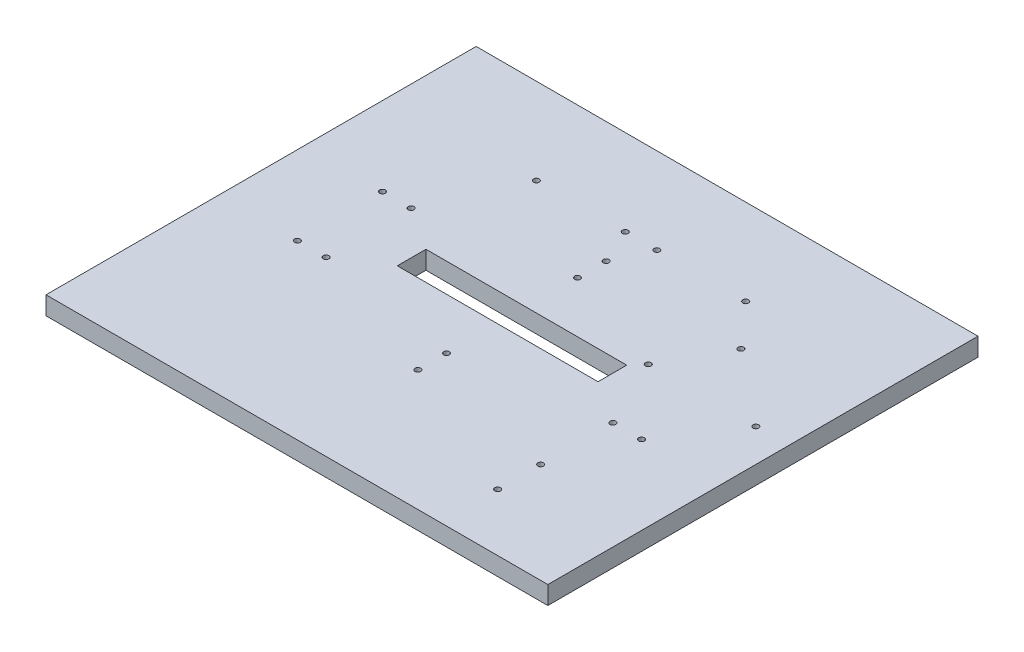
ISO-10303-21;
HEADER;
FILE_DESCRIPTION(('STEP AP214'),'2;1');
FILE_NAME('part.step','',(''),(''),'','','');
FILE_SCHEMA(('AUTOMOTIVE_DESIGN { 1 0 10303 214 1 1 1 1 }'));
ENDSEC;
DATA;
#1=APPLICATION_CONTEXT('core data for automotive mechanical design processes');
#2=APPLICATION_PROTOCOL_DEFINITION('international standard','automotive_design',2000,#1);
#3=PRODUCT_CONTEXT('',#1,'mechanical');
#4=PRODUCT('Part','Part','',(#3));
#5=PRODUCT_RELATED_PRODUCT_CATEGORY('part','',(#4));
#6=PRODUCT_DEFINITION_FORMATION('','',#4);
#7=PRODUCT_DEFINITION_CONTEXT('part definition',#1,'design');
#8=PRODUCT_DEFINITION('design','',#6,#7);
#9=PRODUCT_DEFINITION_SHAPE('','',#8);
#10=(LENGTH_UNIT() NAMED_UNIT(*) SI_UNIT(.MILLI.,.METRE.));
#11=(NAMED_UNIT(*) PLANE_ANGLE_UNIT() SI_UNIT($,.RADIAN.));
#12=(NAMED_UNIT(*) SI_UNIT($,.STERADIAN.) SOLID_ANGLE_UNIT());
#13=UNCERTAINTY_MEASURE_WITH_UNIT(LENGTH_MEASURE(1.E-05),#10,'distance_accuracy_value','');
#14=(GEOMETRIC_REPRESENTATION_CONTEXT(3) GLOBAL_UNCERTAINTY_ASSIGNED_CONTEXT((#13)) GLOBAL_UNIT_ASSIGNED_CONTEXT((#10,
#11,#12)) REPRESENTATION_CONTEXT('',''));
#15=CARTESIAN_POINT('',(0.,0.,0.));
#16=DIRECTION('',(0.,0.,1.));
#17=DIRECTION('',(1.,0.,0.));
#18=AXIS2_PLACEMENT_3D('',#15,#16,#17);
#19=CARTESIAN_POINT('',(0.,12.7,0.));
#20=DIRECTION('',(0.,1.,0.));
#21=DIRECTION('',(0.,0.,1.));
#22=AXIS2_PLACEMENT_3D('',#19,#20,#21);
#23=PLANE('',#22);
#24=CARTESIAN_POINT('',(55.,12.7,-179.65));
#25=DIRECTION('',(0.,1.,0.));
#26=DIRECTION('',(0.,0.,1.));
#27=AXIS2_PLACEMENT_3D('',#24,#25,#26);
#28=CIRCLE('',#27,2.);
#29=CARTESIAN_POINT('',(55.,12.7,-177.65));
#30=VERTEX_POINT('',#29);
#31=EDGE_CURVE('E305',#30,#30,#28,.T.);
#32=ORIENTED_EDGE('',*,*,#31,.F.);
#33=EDGE_LOOP('',(#32));
#34=FACE_BOUND('',#33,.T.);
#35=CARTESIAN_POINT('',(327.05535410762,12.7,-168.));
#36=DIRECTION('',(0.,1.,0.));
#37=DIRECTION('',(0.,0.,1.));
#38=AXIS2_PLACEMENT_3D('',#35,#36,#37);
#39=CIRCLE('',#38,2.);
#40=CARTESIAN_POINT('',(327.05535410762,12.7,-166.));
#41=VERTEX_POINT('',#40);
#42=EDGE_CURVE('E317',#41,#41,#39,.T.);
#43=ORIENTED_EDGE('',*,*,#42,.F.);
#44=EDGE_LOOP('',(#43));
#45=FACE_BOUND('',#44,.T.);
#46=CARTESIAN_POINT('',(295.,12.7,-120.35));
#47=DIRECTION('',(0.,1.,0.));
#48=DIRECTION('',(0.,0.,1.));
#49=AXIS2_PLACEMENT_3D('',#46,#47,#48);
#50=CIRCLE('',#49,2.);
#51=CARTESIAN_POINT('',(295.,12.7,-118.35));
#52=VERTEX_POINT('',#51);
#53=EDGE_CURVE('E329',#52,#52,#50,.T.);
#54=ORIENTED_EDGE('',*,*,#53,.F.);
#55=EDGE_LOOP('',(#54));
#56=FACE_BOUND('',#55,.T.);
#57=CARTESIAN_POINT('',(55.,12.7,-120.35));
#58=DIRECTION('',(0.,1.,0.));
#59=DIRECTION('',(0.,0.,1.));
#60=AXIS2_PLACEMENT_3D('',#57,#58,#59);
#61=CIRCLE('',#60,2.);
#62=CARTESIAN_POINT('',(55.,12.7,-118.35));
#63=VERTEX_POINT('',#62);
#64=EDGE_CURVE('E341',#63,#63,#61,.T.);
#65=ORIENTED_EDGE('',*,*,#64,.F.);
#66=EDGE_LOOP('',(#65));
#67=FACE_BOUND('',#66,.T.);
#68=CARTESIAN_POINT('',(175.,12.7,-104.35));
#69=DIRECTION('',(0.,1.,0.));
#70=DIRECTION('',(0.,0.,1.));
#71=AXIS2_PLACEMENT_3D('',#68,#69,#70);
#72=CIRCLE('',#71,1.99999999999997);
#73=CARTESIAN_POINT('',(175.,12.7,-102.35));
#74=VERTEX_POINT('',#73);
#75=EDGE_CURVE('E353',#74,#74,#72,.T.);
#76=ORIENTED_EDGE('',*,*,#75,.F.);
#77=EDGE_LOOP('',(#76));
#78=FACE_BOUND('',#77,.T.);
#79=CARTESIAN_POINT('',(175.,12.7,-195.65));
#80=DIRECTION('',(0.,1.,0.));
#81=DIRECTION('',(0.,0.,1.));
#82=AXIS2_PLACEMENT_3D('',#79,#80,#81);
#83=CIRCLE('',#82,2.00000000000002);
#84=CARTESIAN_POINT('',(175.,12.7,-193.65));
#85=VERTEX_POINT('',#84);
#86=EDGE_CURVE('E365',#85,#85,#83,.T.);
#87=ORIENTED_EDGE('',*,*,#86,.F.);
#88=EDGE_LOOP('',(#87));
#89=FACE_BOUND('',#88,.T.);
#90=CARTESIAN_POINT('',(164.,12.7,-240.));
#91=DIRECTION('',(0.,1.,0.));
#92=DIRECTION('',(0.,0.,1.));
#93=AXIS2_PLACEMENT_3D('',#90,#91,#92);
#94=CIRCLE('',#93,2.);
#95=CARTESIAN_POINT('',(164.,12.7,-238.));
#96=VERTEX_POINT('',#95);
#97=EDGE_CURVE('E377',#96,#96,#94,.T.);
#98=ORIENTED_EDGE('',*,*,#97,.F.);
#99=EDGE_LOOP('',(#98));
#100=FACE_BOUND('',#99,.T.);
#101=CARTESIAN_POINT('',(275.,12.7,-40.));
#102=DIRECTION('',(0.,1.,0.));
#103=DIRECTION('',(0.,0.,1.));
#104=AXIS2_PLACEMENT_3D('',#101,#102,#103);
#105=CIRCLE('',#104,1.99999999999994);
#106=CARTESIAN_POINT('',(275.,12.7,-38.0000000000001));
#107=VERTEX_POINT('',#106);
#108=EDGE_CURVE('E389',#107,#107,#105,.T.);
#109=ORIENTED_EDGE('',*,*,#108,.F.);
#110=EDGE_LOOP('',(#109));
#111=FACE_BOUND('',#110,.T.);
#112=CARTESIAN_POINT('',(248.,12.7,-240.));
#113=DIRECTION('',(0.,1.,0.));
#114=DIRECTION('',(0.,0.,1.));
#115=AXIS2_PLACEMENT_3D('',#112,#113,#114);
#116=CIRCLE('',#115,2.);
#117=CARTESIAN_POINT('',(248.,12.7,-238.));
#118=VERTEX_POINT('',#117);
#119=EDGE_CURVE('E401',#118,#118,#116,.T.);
#120=ORIENTED_EDGE('',*,*,#119,.F.);
#121=EDGE_LOOP('',(#120));
#122=FACE_BOUND('',#121,.T.);
#123=DIRECTION('',(1.,0.,0.));
#124=VECTOR('',#123,1.);
#125=CARTESIAN_POINT('',(245.,12.7,-140.));
#126=LINE('',#125,#124);
#127=CARTESIAN_POINT('',(105.,12.7,-140.));
#128=VERTEX_POINT('',#127);
#129=CARTESIAN_POINT('',(245.,12.7,-140.));
#130=VERTEX_POINT('',#129);
#131=EDGE_CURVE('E106',#128,#130,#126,.T.);
#132=ORIENTED_EDGE('',*,*,#131,.F.);
#133=DIRECTION('',(0.,0.,1.));
#134=VECTOR('',#133,1.);
#135=CARTESIAN_POINT('',(105.,12.7,-140.));
#136=LINE('',#135,#134);
#137=CARTESIAN_POINT('',(105.,12.7,-160.));
#138=VERTEX_POINT('',#137);
#139=EDGE_CURVE('E98',#138,#128,#136,.T.);
#140=ORIENTED_EDGE('',*,*,#139,.F.);
#141=DIRECTION('',(-1.,0.,0.));
#142=VECTOR('',#141,1.);
#143=CARTESIAN_POINT('',(245.,12.7,-160.));
#144=LINE('',#143,#142);
#145=CARTESIAN_POINT('',(245.,12.7,-160.));
#146=VERTEX_POINT('',#145);
#147=EDGE_CURVE('E121',#146,#138,#144,.T.);
#148=ORIENTED_EDGE('',*,*,#147,.F.);
#149=DIRECTION('',(0.,0.,-1.));
#150=VECTOR('',#149,1.);
#151=CARTESIAN_POINT('',(245.,12.7,-140.));
#152=LINE('',#151,#150);
#153=EDGE_CURVE('E119',#130,#146,#152,.T.);
#154=ORIENTED_EDGE('',*,*,#153,.F.);
#155=EDGE_LOOP('',(#132,#140,#148,#154));
#156=FACE_BOUND('',#155,.T.);
#157=DIRECTION('',(0.,0.,1.));
#158=VECTOR('',#157,1.);
#159=CARTESIAN_POINT('',(0.,12.7,-300.));
#160=LINE('',#159,#158);
#161=CARTESIAN_POINT('',(0.,12.7,-300.));
#162=VERTEX_POINT('',#161);
#163=CARTESIAN_POINT('',(0.,12.7,0.));
#164=VERTEX_POINT('',#163);
#165=EDGE_CURVE('E137',#162,#164,#160,.T.);
#166=ORIENTED_EDGE('',*,*,#165,.T.);
#167=DIRECTION('',(1.,0.,0.));
#168=VECTOR('',#167,1.);
#169=CARTESIAN_POINT('',(0.,12.7,0.));
#170=LINE('',#169,#168);
#171=CARTESIAN_POINT('',(350.,12.7,0.));
#172=VERTEX_POINT('',#171);
#173=EDGE_CURVE('E140',#164,#172,#170,.T.);
#174=ORIENTED_EDGE('',*,*,#173,.T.);
#175=DIRECTION('',(0.,0.,-1.));
#176=VECTOR('',#175,1.);
#177=CARTESIAN_POINT('',(350.,12.7,0.));
#178=LINE('',#177,#176);
#179=CARTESIAN_POINT('',(350.,12.7,-300.));
#180=VERTEX_POINT('',#179);
#181=EDGE_CURVE('E143',#172,#180,#178,.T.);
#182=ORIENTED_EDGE('',*,*,#181,.T.);
#183=DIRECTION('',(-1.,0.,0.));
#184=VECTOR('',#183,1.);
#185=CARTESIAN_POINT('',(0.,12.7,-300.));
#186=LINE('',#185,#184);
#187=EDGE_CURVE('E145',#180,#162,#186,.T.);
#188=ORIENTED_EDGE('',*,*,#187,.T.);
#189=EDGE_LOOP('',(#166,#174,#182,#188));
#190=FACE_BOUND('',#189,.T.);
#191=CARTESIAN_POINT('',(102.,12.7,-240.));
#192=DIRECTION('',(0.,1.,0.));
#193=DIRECTION('',(0.,0.,1.));
#194=AXIS2_PLACEMENT_3D('',#191,#192,#193);
#195=CIRCLE('',#194,2.);
#196=CARTESIAN_POINT('',(102.,12.7,-238.));
#197=VERTEX_POINT('',#196);
#198=EDGE_CURVE('E127',#197,#197,#195,.T.);
#199=ORIENTED_EDGE('',*,*,#198,.F.);
#200=EDGE_LOOP('',(#199));
#201=FACE_BOUND('',#200,.T.);
#202=CARTESIAN_POINT('',(275.,12.7,-70.));
#203=DIRECTION('',(0.,1.,0.));
#204=DIRECTION('',(0.,0.,1.));
#205=AXIS2_PLACEMENT_3D('',#202,#203,#204);
#206=CIRCLE('',#205,2.);
#207=CARTESIAN_POINT('',(275.,12.7,-68.));
#208=VERTEX_POINT('',#207);
#209=EDGE_CURVE('E395',#208,#208,#206,.T.);
#210=ORIENTED_EDGE('',*,*,#209,.F.);
#211=EDGE_LOOP('',(#210));
#212=FACE_BOUND('',#211,.T.);
#213=CARTESIAN_POINT('',(186.,12.7,-240.));
#214=DIRECTION('',(0.,1.,0.));
#215=DIRECTION('',(0.,0.,1.));
#216=AXIS2_PLACEMENT_3D('',#213,#214,#215);
#217=CIRCLE('',#216,2.);
#218=CARTESIAN_POINT('',(186.,12.7,-238.));
#219=VERTEX_POINT('',#218);
#220=EDGE_CURVE('E383',#219,#219,#217,.T.);
#221=ORIENTED_EDGE('',*,*,#220,.F.);
#222=EDGE_LOOP('',(#221));
#223=FACE_BOUND('',#222,.T.);
#224=CARTESIAN_POINT('',(75.,12.7,-120.35));
#225=DIRECTION('',(0.,1.,0.));
#226=DIRECTION('',(0.,0.,1.));
#227=AXIS2_PLACEMENT_3D('',#224,#225,#226);
#228=CIRCLE('',#227,2.);
#229=CARTESIAN_POINT('',(75.,12.7,-118.35));
#230=VERTEX_POINT('',#229);
#231=EDGE_CURVE('E371',#230,#230,#228,.T.);
#232=ORIENTED_EDGE('',*,*,#231,.F.);
#233=EDGE_LOOP('',(#232));
#234=FACE_BOUND('',#233,.T.);
#235=CARTESIAN_POINT('',(175.,12.7,-215.65));
#236=DIRECTION('',(0.,1.,0.));
#237=DIRECTION('',(0.,0.,1.));
#238=AXIS2_PLACEMENT_3D('',#235,#236,#237);
#239=CIRCLE('',#238,2.);
#240=CARTESIAN_POINT('',(175.,12.7,-213.65));
#241=VERTEX_POINT('',#240);
#242=EDGE_CURVE('E359',#241,#241,#239,.T.);
#243=ORIENTED_EDGE('',*,*,#242,.F.);
#244=EDGE_LOOP('',(#243));
#245=FACE_BOUND('',#244,.T.);
#246=CARTESIAN_POINT('',(175.,12.7,-84.35));
#247=DIRECTION('',(0.,1.,0.));
#248=DIRECTION('',(0.,0.,1.));
#249=AXIS2_PLACEMENT_3D('',#246,#247,#248);
#250=CIRCLE('',#249,1.99999999999997);
#251=CARTESIAN_POINT('',(175.,12.7,-82.35));
#252=VERTEX_POINT('',#251);
#253=EDGE_CURVE('E347',#252,#252,#250,.T.);
#254=ORIENTED_EDGE('',*,*,#253,.F.);
#255=EDGE_LOOP('',(#254));
#256=FACE_BOUND('',#255,.T.);
#257=CARTESIAN_POINT('',(275.,12.7,-120.35));
#258=DIRECTION('',(0.,1.,0.));
#259=DIRECTION('',(0.,0.,1.));
#260=AXIS2_PLACEMENT_3D('',#257,#258,#259);
#261=CIRCLE('',#260,2.);
#262=CARTESIAN_POINT('',(275.,12.7,-118.35));
#263=VERTEX_POINT('',#262);
#264=EDGE_CURVE('E335',#263,#263,#261,.T.);
#265=ORIENTED_EDGE('',*,*,#264,.F.);
#266=EDGE_LOOP('',(#265));
#267=FACE_BOUND('',#266,.T.);
#268=CARTESIAN_POINT('',(252.055354107619,12.7,-168.));
#269=DIRECTION('',(0.,1.,0.));
#270=DIRECTION('',(0.,0.,1.));
#271=AXIS2_PLACEMENT_3D('',#268,#269,#270);
#272=CIRCLE('',#271,2.);
#273=CARTESIAN_POINT('',(252.055354107619,12.7,-166.));
#274=VERTEX_POINT('',#273);
#275=EDGE_CURVE('E323',#274,#274,#272,.T.);
#276=ORIENTED_EDGE('',*,*,#275,.F.);
#277=EDGE_LOOP('',(#276));
#278=FACE_BOUND('',#277,.T.);
#279=CARTESIAN_POINT('',(75.,12.7,-179.65));
#280=DIRECTION('',(0.,1.,0.));
#281=DIRECTION('',(0.,0.,1.));
#282=AXIS2_PLACEMENT_3D('',#279,#280,#281);
#283=CIRCLE('',#282,2.);
#284=CARTESIAN_POINT('',(75.,12.7,-177.65));
#285=VERTEX_POINT('',#284);
#286=EDGE_CURVE('E311',#285,#285,#283,.T.);
#287=ORIENTED_EDGE('',*,*,#286,.F.);
#288=EDGE_LOOP('',(#287));
#289=FACE_BOUND('',#288,.T.);
#290=CARTESIAN_POINT('',(275.,12.7,-209.65));
#291=DIRECTION('',(0.,1.,0.));
#292=DIRECTION('',(0.,0.,1.));
#293=AXIS2_PLACEMENT_3D('',#290,#291,#292);
#294=CIRCLE('',#293,2.);
#295=CARTESIAN_POINT('',(275.,12.7,-207.65));
#296=VERTEX_POINT('',#295);
#297=EDGE_CURVE('E296',#296,#296,#294,.T.);
#298=ORIENTED_EDGE('',*,*,#297,.F.);
#299=EDGE_LOOP('',(#298));
#300=FACE_BOUND('',#299,.T.);
#301=ADVANCED_FACE('F33',(#34,#45,#56,#67,#78,#89,#100,#111,#122,#156,#190,#201,#212,#223,#234,
#245,#256,#267,#278,#289,#300),#23,.T.);
#302=CARTESIAN_POINT('',(0.,0.,0.));
#303=DIRECTION('',(0.,1.,0.));
#304=DIRECTION('',(0.,0.,1.));
#305=AXIS2_PLACEMENT_3D('',#302,#303,#304);
#306=PLANE('',#305);
#307=DIRECTION('',(0.,0.,1.));
#308=VECTOR('',#307,1.);
#309=CARTESIAN_POINT('',(0.,0.,-300.));
#310=LINE('',#309,#308);
#311=CARTESIAN_POINT('',(0.,0.,-300.));
#312=VERTEX_POINT('',#311);
#313=CARTESIAN_POINT('',(0.,0.,0.));
#314=VERTEX_POINT('',#313);
#315=EDGE_CURVE('E114',#312,#314,#310,.T.);
#316=ORIENTED_EDGE('',*,*,#315,.F.);
#317=DIRECTION('',(-1.,0.,0.));
#318=VECTOR('',#317,1.);
#319=CARTESIAN_POINT('',(0.,0.,-300.));
#320=LINE('',#319,#318);
#321=CARTESIAN_POINT('',(350.,0.,-300.));
#322=VERTEX_POINT('',#321);
#323=EDGE_CURVE('E141',#322,#312,#320,.T.);
#324=ORIENTED_EDGE('',*,*,#323,.F.);
#325=DIRECTION('',(0.,0.,-1.));
#326=VECTOR('',#325,1.);
#327=CARTESIAN_POINT('',(350.,0.,0.));
#328=LINE('',#327,#326);
#329=CARTESIAN_POINT('',(350.,0.,0.));
#330=VERTEX_POINT('',#329);
#331=EDGE_CURVE('E152',#330,#322,#328,.T.);
#332=ORIENTED_EDGE('',*,*,#331,.F.);
#333=DIRECTION('',(1.,0.,0.));
#334=VECTOR('',#333,1.);
#335=CARTESIAN_POINT('',(0.,0.,0.));
#336=LINE('',#335,#334);
#337=EDGE_CURVE('E150',#314,#330,#336,.T.);
#338=ORIENTED_EDGE('',*,*,#337,.F.);
#339=EDGE_LOOP('',(#316,#324,#332,#338));
#340=FACE_BOUND('',#339,.T.);
#341=DIRECTION('',(0.,0.,1.));
#342=VECTOR('',#341,1.);
#343=CARTESIAN_POINT('',(105.,0.,-140.));
#344=LINE('',#343,#342);
#345=CARTESIAN_POINT('',(105.,0.,-160.));
#346=VERTEX_POINT('',#345);
#347=CARTESIAN_POINT('',(105.,0.,-140.));
#348=VERTEX_POINT('',#347);
#349=EDGE_CURVE('E56',#346,#348,#344,.T.);
#350=ORIENTED_EDGE('',*,*,#349,.T.);
#351=DIRECTION('',(1.,0.,0.));
#352=VECTOR('',#351,1.);
#353=CARTESIAN_POINT('',(245.,0.,-140.));
#354=LINE('',#353,#352);
#355=CARTESIAN_POINT('',(245.,0.,-140.));
#356=VERTEX_POINT('',#355);
#357=EDGE_CURVE('E113',#348,#356,#354,.T.);
#358=ORIENTED_EDGE('',*,*,#357,.T.);
#359=DIRECTION('',(0.,0.,-1.));
#360=VECTOR('',#359,1.);
#361=CARTESIAN_POINT('',(245.,0.,-140.));
#362=LINE('',#361,#360);
#363=CARTESIAN_POINT('',(245.,0.,-160.));
#364=VERTEX_POINT('',#363);
#365=EDGE_CURVE('E129',#356,#364,#362,.T.);
#366=ORIENTED_EDGE('',*,*,#365,.T.);
#367=DIRECTION('',(-1.,0.,0.));
#368=VECTOR('',#367,1.);
#369=CARTESIAN_POINT('',(245.,0.,-160.));
#370=LINE('',#369,#368);
#371=EDGE_CURVE('E107',#364,#346,#370,.T.);
#372=ORIENTED_EDGE('',*,*,#371,.T.);
#373=EDGE_LOOP('',(#350,#358,#366,#372));
#374=FACE_BOUND('',#373,.T.);
#375=CARTESIAN_POINT('',(102.,0.,-240.));
#376=DIRECTION('',(0.,1.,0.));
#377=DIRECTION('',(0.,0.,1.));
#378=AXIS2_PLACEMENT_3D('',#375,#376,#377);
#379=CIRCLE('',#378,2.);
#380=CARTESIAN_POINT('',(102.,0.,-238.));
#381=VERTEX_POINT('',#380);
#382=EDGE_CURVE('E404',#381,#381,#379,.T.);
#383=ORIENTED_EDGE('',*,*,#382,.T.);
#384=EDGE_LOOP('',(#383));
#385=FACE_BOUND('',#384,.T.);
#386=CARTESIAN_POINT('',(248.,0.,-240.));
#387=DIRECTION('',(0.,1.,0.));
#388=DIRECTION('',(0.,0.,1.));
#389=AXIS2_PLACEMENT_3D('',#386,#387,#388);
#390=CIRCLE('',#389,2.);
#391=CARTESIAN_POINT('',(248.,0.,-238.));
#392=VERTEX_POINT('',#391);
#393=EDGE_CURVE('E398',#392,#392,#390,.T.);
#394=ORIENTED_EDGE('',*,*,#393,.T.);
#395=EDGE_LOOP('',(#394));
#396=FACE_BOUND('',#395,.T.);
#397=CARTESIAN_POINT('',(275.,0.,-70.));
#398=DIRECTION('',(0.,1.,0.));
#399=DIRECTION('',(0.,0.,1.));
#400=AXIS2_PLACEMENT_3D('',#397,#398,#399);
#401=CIRCLE('',#400,2.);
#402=CARTESIAN_POINT('',(275.,0.,-68.));
#403=VERTEX_POINT('',#402);
#404=EDGE_CURVE('E392',#403,#403,#401,.T.);
#405=ORIENTED_EDGE('',*,*,#404,.T.);
#406=EDGE_LOOP('',(#405));
#407=FACE_BOUND('',#406,.T.);
#408=CARTESIAN_POINT('',(275.,0.,-40.));
#409=DIRECTION('',(0.,1.,0.));
#410=DIRECTION('',(0.,0.,1.));
#411=AXIS2_PLACEMENT_3D('',#408,#409,#410);
#412=CIRCLE('',#411,1.99999999999994);
#413=CARTESIAN_POINT('',(275.,0.,-38.0000000000001));
#414=VERTEX_POINT('',#413);
#415=EDGE_CURVE('E386',#414,#414,#412,.T.);
#416=ORIENTED_EDGE('',*,*,#415,.T.);
#417=EDGE_LOOP('',(#416));
#418=FACE_BOUND('',#417,.T.);
#419=CARTESIAN_POINT('',(186.,0.,-240.));
#420=DIRECTION('',(0.,1.,0.));
#421=DIRECTION('',(0.,0.,1.));
#422=AXIS2_PLACEMENT_3D('',#419,#420,#421);
#423=CIRCLE('',#422,2.);
#424=CARTESIAN_POINT('',(186.,0.,-238.));
#425=VERTEX_POINT('',#424);
#426=EDGE_CURVE('E380',#425,#425,#423,.T.);
#427=ORIENTED_EDGE('',*,*,#426,.T.);
#428=EDGE_LOOP('',(#427));
#429=FACE_BOUND('',#428,.T.);
#430=CARTESIAN_POINT('',(164.,0.,-240.));
#431=DIRECTION('',(0.,1.,0.));
#432=DIRECTION('',(0.,0.,1.));
#433=AXIS2_PLACEMENT_3D('',#430,#431,#432);
#434=CIRCLE('',#433,2.);
#435=CARTESIAN_POINT('',(164.,0.,-238.));
#436=VERTEX_POINT('',#435);
#437=EDGE_CURVE('E374',#436,#436,#434,.T.);
#438=ORIENTED_EDGE('',*,*,#437,.T.);
#439=EDGE_LOOP('',(#438));
#440=FACE_BOUND('',#439,.T.);
#441=CARTESIAN_POINT('',(75.,0.,-120.35));
#442=DIRECTION('',(0.,1.,0.));
#443=DIRECTION('',(0.,0.,1.));
#444=AXIS2_PLACEMENT_3D('',#441,#442,#443);
#445=CIRCLE('',#444,2.);
#446=CARTESIAN_POINT('',(75.,0.,-118.35));
#447=VERTEX_POINT('',#446);
#448=EDGE_CURVE('E368',#447,#447,#445,.T.);
#449=ORIENTED_EDGE('',*,*,#448,.T.);
#450=EDGE_LOOP('',(#449));
#451=FACE_BOUND('',#450,.T.);
#452=CARTESIAN_POINT('',(175.,0.,-195.65));
#453=DIRECTION('',(0.,1.,0.));
#454=DIRECTION('',(0.,0.,1.));
#455=AXIS2_PLACEMENT_3D('',#452,#453,#454);
#456=CIRCLE('',#455,2.00000000000002);
#457=CARTESIAN_POINT('',(175.,0.,-193.65));
#458=VERTEX_POINT('',#457);
#459=EDGE_CURVE('E362',#458,#458,#456,.T.);
#460=ORIENTED_EDGE('',*,*,#459,.T.);
#461=EDGE_LOOP('',(#460));
#462=FACE_BOUND('',#461,.T.);
#463=CARTESIAN_POINT('',(175.,0.,-215.65));
#464=DIRECTION('',(0.,1.,0.));
#465=DIRECTION('',(0.,0.,1.));
#466=AXIS2_PLACEMENT_3D('',#463,#464,#465);
#467=CIRCLE('',#466,2.);
#468=CARTESIAN_POINT('',(175.,0.,-213.65));
#469=VERTEX_POINT('',#468);
#470=EDGE_CURVE('E356',#469,#469,#467,.T.);
#471=ORIENTED_EDGE('',*,*,#470,.T.);
#472=EDGE_LOOP('',(#471));
#473=FACE_BOUND('',#472,.T.);
#474=CARTESIAN_POINT('',(175.,0.,-104.35));
#475=DIRECTION('',(0.,1.,0.));
#476=DIRECTION('',(0.,0.,1.));
#477=AXIS2_PLACEMENT_3D('',#474,#475,#476);
#478=CIRCLE('',#477,1.99999999999997);
#479=CARTESIAN_POINT('',(175.,0.,-102.35));
#480=VERTEX_POINT('',#479);
#481=EDGE_CURVE('E350',#480,#480,#478,.T.);
#482=ORIENTED_EDGE('',*,*,#481,.T.);
#483=EDGE_LOOP('',(#482));
#484=FACE_BOUND('',#483,.T.);
#485=CARTESIAN_POINT('',(175.,0.,-84.35));
#486=DIRECTION('',(0.,1.,0.));
#487=DIRECTION('',(0.,0.,1.));
#488=AXIS2_PLACEMENT_3D('',#485,#486,#487);
#489=CIRCLE('',#488,1.99999999999997);
#490=CARTESIAN_POINT('',(175.,0.,-82.35));
#491=VERTEX_POINT('',#490);
#492=EDGE_CURVE('E344',#491,#491,#489,.T.);
#493=ORIENTED_EDGE('',*,*,#492,.T.);
#494=EDGE_LOOP('',(#493));
#495=FACE_BOUND('',#494,.T.);
#496=CARTESIAN_POINT('',(55.,0.,-120.35));
#497=DIRECTION('',(0.,1.,0.));
#498=DIRECTION('',(0.,0.,1.));
#499=AXIS2_PLACEMENT_3D('',#496,#497,#498);
#500=CIRCLE('',#499,2.);
#501=CARTESIAN_POINT('',(55.,0.,-118.35));
#502=VERTEX_POINT('',#501);
#503=EDGE_CURVE('E338',#502,#502,#500,.T.);
#504=ORIENTED_EDGE('',*,*,#503,.T.);
#505=EDGE_LOOP('',(#504));
#506=FACE_BOUND('',#505,.T.);
#507=CARTESIAN_POINT('',(275.,0.,-120.35));
#508=DIRECTION('',(0.,1.,0.));
#509=DIRECTION('',(0.,0.,1.));
#510=AXIS2_PLACEMENT_3D('',#507,#508,#509);
#511=CIRCLE('',#510,2.);
#512=CARTESIAN_POINT('',(275.,0.,-118.35));
#513=VERTEX_POINT('',#512);
#514=EDGE_CURVE('E332',#513,#513,#511,.T.);
#515=ORIENTED_EDGE('',*,*,#514,.T.);
#516=EDGE_LOOP('',(#515));
#517=FACE_BOUND('',#516,.T.);
#518=CARTESIAN_POINT('',(295.,0.,-120.35));
#519=DIRECTION('',(0.,1.,0.));
#520=DIRECTION('',(0.,0.,1.));
#521=AXIS2_PLACEMENT_3D('',#518,#519,#520);
#522=CIRCLE('',#521,2.);
#523=CARTESIAN_POINT('',(295.,0.,-118.35));
#524=VERTEX_POINT('',#523);
#525=EDGE_CURVE('E326',#524,#524,#522,.T.);
#526=ORIENTED_EDGE('',*,*,#525,.T.);
#527=EDGE_LOOP('',(#526));
#528=FACE_BOUND('',#527,.T.);
#529=CARTESIAN_POINT('',(252.055354107619,0.,-168.));
#530=DIRECTION('',(0.,1.,0.));
#531=DIRECTION('',(0.,0.,1.));
#532=AXIS2_PLACEMENT_3D('',#529,#530,#531);
#533=CIRCLE('',#532,2.);
#534=CARTESIAN_POINT('',(252.055354107619,0.,-166.));
#535=VERTEX_POINT('',#534);
#536=EDGE_CURVE('E320',#535,#535,#533,.T.);
#537=ORIENTED_EDGE('',*,*,#536,.T.);
#538=EDGE_LOOP('',(#537));
#539=FACE_BOUND('',#538,.T.);
#540=CARTESIAN_POINT('',(327.05535410762,0.,-168.));
#541=DIRECTION('',(0.,1.,0.));
#542=DIRECTION('',(0.,0.,1.));
#543=AXIS2_PLACEMENT_3D('',#540,#541,#542);
#544=CIRCLE('',#543,2.);
#545=CARTESIAN_POINT('',(327.05535410762,0.,-166.));
#546=VERTEX_POINT('',#545);
#547=EDGE_CURVE('E314',#546,#546,#544,.T.);
#548=ORIENTED_EDGE('',*,*,#547,.T.);
#549=EDGE_LOOP('',(#548));
#550=FACE_BOUND('',#549,.T.);
#551=CARTESIAN_POINT('',(75.,0.,-179.65));
#552=DIRECTION('',(0.,1.,0.));
#553=DIRECTION('',(0.,0.,1.));
#554=AXIS2_PLACEMENT_3D('',#551,#552,#553);
#555=CIRCLE('',#554,2.);
#556=CARTESIAN_POINT('',(75.,0.,-177.65));
#557=VERTEX_POINT('',#556);
#558=EDGE_CURVE('E308',#557,#557,#555,.T.);
#559=ORIENTED_EDGE('',*,*,#558,.T.);
#560=EDGE_LOOP('',(#559));
#561=FACE_BOUND('',#560,.T.);
#562=CARTESIAN_POINT('',(55.,0.,-179.65));
#563=DIRECTION('',(0.,1.,0.));
#564=DIRECTION('',(0.,0.,1.));
#565=AXIS2_PLACEMENT_3D('',#562,#563,#564);
#566=CIRCLE('',#565,2.);
#567=CARTESIAN_POINT('',(55.,0.,-177.65));
#568=VERTEX_POINT('',#567);
#569=EDGE_CURVE('E302',#568,#568,#566,.T.);
#570=ORIENTED_EDGE('',*,*,#569,.T.);
#571=EDGE_LOOP('',(#570));
#572=FACE_BOUND('',#571,.T.);
#573=CARTESIAN_POINT('',(275.,0.,-209.65));
#574=DIRECTION('',(0.,1.,0.));
#575=DIRECTION('',(0.,0.,1.));
#576=AXIS2_PLACEMENT_3D('',#573,#574,#575);
#577=CIRCLE('',#576,2.);
#578=CARTESIAN_POINT('',(275.,0.,-207.65));
#579=VERTEX_POINT('',#578);
#580=EDGE_CURVE('E299',#579,#579,#577,.T.);
#581=ORIENTED_EDGE('',*,*,#580,.T.);
#582=EDGE_LOOP('',(#581));
#583=FACE_BOUND('',#582,.T.);
#584=ADVANCED_FACE('F170',(#340,#374,#385,#396,#407,#418,#429,#440,#451,#462,#473,#484,#495,
#506,#517,#528,#539,#550,#561,#572,#583),#306,.F.);
#585=CARTESIAN_POINT('',(0.,12.7,-300.));
#586=DIRECTION('',(1.,0.,0.));
#587=DIRECTION('',(0.,0.,-1.));
#588=AXIS2_PLACEMENT_3D('',#585,#586,#587);
#589=PLANE('',#588);
#590=ORIENTED_EDGE('',*,*,#315,.T.);
#591=DIRECTION('',(0.,-1.,0.));
#592=VECTOR('',#591,1.);
#593=CARTESIAN_POINT('',(0.,12.7,0.));
#594=LINE('',#593,#592);
#595=EDGE_CURVE('E11',#164,#314,#594,.T.);
#596=ORIENTED_EDGE('',*,*,#595,.F.);
#597=ORIENTED_EDGE('',*,*,#165,.F.);
#598=DIRECTION('',(0.,-1.,0.));
#599=VECTOR('',#598,1.);
#600=CARTESIAN_POINT('',(0.,12.7,-300.));
#601=LINE('',#600,#599);
#602=EDGE_CURVE('E147',#162,#312,#601,.T.);
#603=ORIENTED_EDGE('',*,*,#602,.T.);
#604=EDGE_LOOP('',(#590,#596,#597,#603));
#605=FACE_BOUND('',#604,.T.);
#606=ADVANCED_FACE('F35',(#605),#589,.F.);
#607=CARTESIAN_POINT('',(0.,12.7,0.));
#608=DIRECTION('',(0.,0.,-1.));
#609=DIRECTION('',(-1.,0.,0.));
#610=AXIS2_PLACEMENT_3D('',#607,#608,#609);
#611=PLANE('',#610);
#612=ORIENTED_EDGE('',*,*,#337,.T.);
#613=DIRECTION('',(0.,-1.,0.));
#614=VECTOR('',#613,1.);
#615=CARTESIAN_POINT('',(350.,12.7,0.));
#616=LINE('',#615,#614);
#617=EDGE_CURVE('E41',#172,#330,#616,.T.);
#618=ORIENTED_EDGE('',*,*,#617,.F.);
#619=ORIENTED_EDGE('',*,*,#173,.F.);
#620=ORIENTED_EDGE('',*,*,#595,.T.);
#621=EDGE_LOOP('',(#612,#618,#619,#620));
#622=FACE_BOUND('',#621,.T.);
#623=ADVANCED_FACE('F180',(#622),#611,.F.);
#624=CARTESIAN_POINT('',(350.,12.7,0.));
#625=DIRECTION('',(-1.,0.,0.));
#626=DIRECTION('',(0.,0.,1.));
#627=AXIS2_PLACEMENT_3D('',#624,#625,#626);
#628=PLANE('',#627);
#629=ORIENTED_EDGE('',*,*,#331,.T.);
#630=DIRECTION('',(0.,-1.,0.));
#631=VECTOR('',#630,1.);
#632=CARTESIAN_POINT('',(350.,12.7,-300.));
#633=LINE('',#632,#631);
#634=EDGE_CURVE('E157',#180,#322,#633,.T.);
#635=ORIENTED_EDGE('',*,*,#634,.F.);
#636=ORIENTED_EDGE('',*,*,#181,.F.);
#637=ORIENTED_EDGE('',*,*,#617,.T.);
#638=EDGE_LOOP('',(#629,#635,#636,#637));
#639=FACE_BOUND('',#638,.T.);
#640=ADVANCED_FACE('F164',(#639),#628,.F.);
#641=CARTESIAN_POINT('',(0.,12.7,-300.));
#642=DIRECTION('',(0.,0.,1.));
#643=DIRECTION('',(1.,0.,0.));
#644=AXIS2_PLACEMENT_3D('',#641,#642,#643);
#645=PLANE('',#644);
#646=ORIENTED_EDGE('',*,*,#323,.T.);
#647=ORIENTED_EDGE('',*,*,#602,.F.);
#648=ORIENTED_EDGE('',*,*,#187,.F.);
#649=ORIENTED_EDGE('',*,*,#634,.T.);
#650=EDGE_LOOP('',(#646,#647,#648,#649));
#651=FACE_BOUND('',#650,.T.);
#652=ADVANCED_FACE('F174',(#651),#645,.F.);
#653=CARTESIAN_POINT('',(105.,12.7,-140.));
#654=DIRECTION('',(1.,0.,0.));
#655=DIRECTION('',(0.,0.,-1.));
#656=AXIS2_PLACEMENT_3D('',#653,#654,#655);
#657=PLANE('',#656);
#658=ORIENTED_EDGE('',*,*,#349,.F.);
#659=DIRECTION('',(0.,-1.,0.));
#660=VECTOR('',#659,1.);
#661=CARTESIAN_POINT('',(105.,12.7,-160.));
#662=LINE('',#661,#660);
#663=EDGE_CURVE('E102',#138,#346,#662,.T.);
#664=ORIENTED_EDGE('',*,*,#663,.F.);
#665=ORIENTED_EDGE('',*,*,#139,.T.);
#666=DIRECTION('',(0.,-1.,0.));
#667=VECTOR('',#666,1.);
#668=CARTESIAN_POINT('',(105.,12.7,-140.));
#669=LINE('',#668,#667);
#670=EDGE_CURVE('E101',#128,#348,#669,.T.);
#671=ORIENTED_EDGE('',*,*,#670,.T.);
#672=EDGE_LOOP('',(#658,#664,#665,#671));
#673=FACE_BOUND('',#672,.T.);
#674=ADVANCED_FACE('F100',(#673),#657,.T.);
#675=CARTESIAN_POINT('',(245.,12.7,-140.));
#676=DIRECTION('',(0.,0.,-1.));
#677=DIRECTION('',(-1.,0.,0.));
#678=AXIS2_PLACEMENT_3D('',#675,#676,#677);
#679=PLANE('',#678);
#680=ORIENTED_EDGE('',*,*,#357,.F.);
#681=ORIENTED_EDGE('',*,*,#670,.F.);
#682=ORIENTED_EDGE('',*,*,#131,.T.);
#683=DIRECTION('',(0.,-1.,0.));
#684=VECTOR('',#683,1.);
#685=CARTESIAN_POINT('',(245.,12.7,-140.));
#686=LINE('',#685,#684);
#687=EDGE_CURVE('E115',#130,#356,#686,.T.);
#688=ORIENTED_EDGE('',*,*,#687,.T.);
#689=EDGE_LOOP('',(#680,#681,#682,#688));
#690=FACE_BOUND('',#689,.T.);
#691=ADVANCED_FACE('F110',(#690),#679,.T.);
#692=CARTESIAN_POINT('',(245.,12.7,-140.));
#693=DIRECTION('',(-1.,0.,0.));
#694=DIRECTION('',(0.,0.,1.));
#695=AXIS2_PLACEMENT_3D('',#692,#693,#694);
#696=PLANE('',#695);
#697=ORIENTED_EDGE('',*,*,#365,.F.);
#698=ORIENTED_EDGE('',*,*,#687,.F.);
#699=ORIENTED_EDGE('',*,*,#153,.T.);
#700=DIRECTION('',(0.,-1.,0.));
#701=VECTOR('',#700,1.);
#702=CARTESIAN_POINT('',(245.,12.7,-160.));
#703=LINE('',#702,#701);
#704=EDGE_CURVE('E48',#146,#364,#703,.T.);
#705=ORIENTED_EDGE('',*,*,#704,.T.);
#706=EDGE_LOOP('',(#697,#698,#699,#705));
#707=FACE_BOUND('',#706,.T.);
#708=ADVANCED_FACE('F206',(#707),#696,.T.);
#709=CARTESIAN_POINT('',(245.,12.7,-160.));
#710=DIRECTION('',(0.,0.,1.));
#711=DIRECTION('',(1.,0.,0.));
#712=AXIS2_PLACEMENT_3D('',#709,#710,#711);
#713=PLANE('',#712);
#714=ORIENTED_EDGE('',*,*,#371,.F.);
#715=ORIENTED_EDGE('',*,*,#704,.F.);
#716=ORIENTED_EDGE('',*,*,#147,.T.);
#717=ORIENTED_EDGE('',*,*,#663,.T.);
#718=EDGE_LOOP('',(#714,#715,#716,#717));
#719=FACE_BOUND('',#718,.T.);
#720=ADVANCED_FACE('F210',(#719),#713,.T.);
#721=CARTESIAN_POINT('',(102.,12.7,-240.));
#722=DIRECTION('',(0.,-1.,0.));
#723=DIRECTION('',(0.,0.,-1.));
#724=AXIS2_PLACEMENT_3D('',#721,#722,#723);
#725=CYLINDRICAL_SURFACE('',#724,2.);
#726=ORIENTED_EDGE('',*,*,#198,.T.);
#727=EDGE_LOOP('',(#726));
#728=FACE_BOUND('',#727,.T.);
#729=ORIENTED_EDGE('',*,*,#382,.F.);
#730=EDGE_LOOP('',(#729));
#731=FACE_BOUND('',#730,.T.);
#732=ADVANCED_FACE('F216',(#728,#731),#725,.F.);
#733=CARTESIAN_POINT('',(248.,12.7,-240.));
#734=DIRECTION('',(0.,-1.,0.));
#735=DIRECTION('',(0.,0.,-1.));
#736=AXIS2_PLACEMENT_3D('',#733,#734,#735);
#737=CYLINDRICAL_SURFACE('',#736,2.);
#738=ORIENTED_EDGE('',*,*,#119,.T.);
#739=EDGE_LOOP('',(#738));
#740=FACE_BOUND('',#739,.T.);
#741=ORIENTED_EDGE('',*,*,#393,.F.);
#742=EDGE_LOOP('',(#741));
#743=FACE_BOUND('',#742,.T.);
#744=ADVANCED_FACE('F219',(#740,#743),#737,.F.);
#745=CARTESIAN_POINT('',(275.,12.7,-70.));
#746=DIRECTION('',(0.,-1.,0.));
#747=DIRECTION('',(0.,0.,-1.));
#748=AXIS2_PLACEMENT_3D('',#745,#746,#747);
#749=CYLINDRICAL_SURFACE('',#748,2.);
#750=ORIENTED_EDGE('',*,*,#209,.T.);
#751=EDGE_LOOP('',(#750));
#752=FACE_BOUND('',#751,.T.);
#753=ORIENTED_EDGE('',*,*,#404,.F.);
#754=EDGE_LOOP('',(#753));
#755=FACE_BOUND('',#754,.T.);
#756=ADVANCED_FACE('F223',(#752,#755),#749,.F.);
#757=CARTESIAN_POINT('',(275.,12.7,-40.));
#758=DIRECTION('',(0.,-1.,0.));
#759=DIRECTION('',(0.,0.,-1.));
#760=AXIS2_PLACEMENT_3D('',#757,#758,#759);
#761=CYLINDRICAL_SURFACE('',#760,1.99999999999994);
#762=ORIENTED_EDGE('',*,*,#108,.T.);
#763=EDGE_LOOP('',(#762));
#764=FACE_BOUND('',#763,.T.);
#765=ORIENTED_EDGE('',*,*,#415,.F.);
#766=EDGE_LOOP('',(#765));
#767=FACE_BOUND('',#766,.T.);
#768=ADVANCED_FACE('F227',(#764,#767),#761,.F.);
#769=CARTESIAN_POINT('',(186.,12.7,-240.));
#770=DIRECTION('',(0.,-1.,0.));
#771=DIRECTION('',(0.,0.,-1.));
#772=AXIS2_PLACEMENT_3D('',#769,#770,#771);
#773=CYLINDRICAL_SURFACE('',#772,2.);
#774=ORIENTED_EDGE('',*,*,#220,.T.);
#775=EDGE_LOOP('',(#774));
#776=FACE_BOUND('',#775,.T.);
#777=ORIENTED_EDGE('',*,*,#426,.F.);
#778=EDGE_LOOP('',(#777));
#779=FACE_BOUND('',#778,.T.);
#780=ADVANCED_FACE('F231',(#776,#779),#773,.F.);
#781=CARTESIAN_POINT('',(164.,12.7,-240.));
#782=DIRECTION('',(0.,-1.,0.));
#783=DIRECTION('',(0.,0.,-1.));
#784=AXIS2_PLACEMENT_3D('',#781,#782,#783);
#785=CYLINDRICAL_SURFACE('',#784,2.);
#786=ORIENTED_EDGE('',*,*,#97,.T.);
#787=EDGE_LOOP('',(#786));
#788=FACE_BOUND('',#787,.T.);
#789=ORIENTED_EDGE('',*,*,#437,.F.);
#790=EDGE_LOOP('',(#789));
#791=FACE_BOUND('',#790,.T.);
#792=ADVANCED_FACE('F235',(#788,#791),#785,.F.);
#793=CARTESIAN_POINT('',(75.,12.7,-120.35));
#794=DIRECTION('',(0.,-1.,0.));
#795=DIRECTION('',(0.,0.,-1.));
#796=AXIS2_PLACEMENT_3D('',#793,#794,#795);
#797=CYLINDRICAL_SURFACE('',#796,2.);
#798=ORIENTED_EDGE('',*,*,#231,.T.);
#799=EDGE_LOOP('',(#798));
#800=FACE_BOUND('',#799,.T.);
#801=ORIENTED_EDGE('',*,*,#448,.F.);
#802=EDGE_LOOP('',(#801));
#803=FACE_BOUND('',#802,.T.);
#804=ADVANCED_FACE('F239',(#800,#803),#797,.F.);
#805=CARTESIAN_POINT('',(175.,12.7,-195.65));
#806=DIRECTION('',(0.,-1.,0.));
#807=DIRECTION('',(0.,0.,-1.));
#808=AXIS2_PLACEMENT_3D('',#805,#806,#807);
#809=CYLINDRICAL_SURFACE('',#808,2.00000000000002);
#810=ORIENTED_EDGE('',*,*,#86,.T.);
#811=EDGE_LOOP('',(#810));
#812=FACE_BOUND('',#811,.T.);
#813=ORIENTED_EDGE('',*,*,#459,.F.);
#814=EDGE_LOOP('',(#813));
#815=FACE_BOUND('',#814,.T.);
#816=ADVANCED_FACE('F243',(#812,#815),#809,.F.);
#817=CARTESIAN_POINT('',(175.,12.7,-215.65));
#818=DIRECTION('',(0.,-1.,0.));
#819=DIRECTION('',(0.,0.,-1.));
#820=AXIS2_PLACEMENT_3D('',#817,#818,#819);
#821=CYLINDRICAL_SURFACE('',#820,2.);
#822=ORIENTED_EDGE('',*,*,#242,.T.);
#823=EDGE_LOOP('',(#822));
#824=FACE_BOUND('',#823,.T.);
#825=ORIENTED_EDGE('',*,*,#470,.F.);
#826=EDGE_LOOP('',(#825));
#827=FACE_BOUND('',#826,.T.);
#828=ADVANCED_FACE('F247',(#824,#827),#821,.F.);
#829=CARTESIAN_POINT('',(175.,12.7,-104.35));
#830=DIRECTION('',(0.,-1.,0.));
#831=DIRECTION('',(0.,0.,-1.));
#832=AXIS2_PLACEMENT_3D('',#829,#830,#831);
#833=CYLINDRICAL_SURFACE('',#832,1.99999999999997);
#834=ORIENTED_EDGE('',*,*,#75,.T.);
#835=EDGE_LOOP('',(#834));
#836=FACE_BOUND('',#835,.T.);
#837=ORIENTED_EDGE('',*,*,#481,.F.);
#838=EDGE_LOOP('',(#837));
#839=FACE_BOUND('',#838,.T.);
#840=ADVANCED_FACE('F251',(#836,#839),#833,.F.);
#841=CARTESIAN_POINT('',(175.,12.7,-84.35));
#842=DIRECTION('',(0.,-1.,0.));
#843=DIRECTION('',(0.,0.,-1.));
#844=AXIS2_PLACEMENT_3D('',#841,#842,#843);
#845=CYLINDRICAL_SURFACE('',#844,1.99999999999997);
#846=ORIENTED_EDGE('',*,*,#253,.T.);
#847=EDGE_LOOP('',(#846));
#848=FACE_BOUND('',#847,.T.);
#849=ORIENTED_EDGE('',*,*,#492,.F.);
#850=EDGE_LOOP('',(#849));
#851=FACE_BOUND('',#850,.T.);
#852=ADVANCED_FACE('F255',(#848,#851),#845,.F.);
#853=CARTESIAN_POINT('',(55.,12.7,-120.35));
#854=DIRECTION('',(0.,-1.,0.));
#855=DIRECTION('',(0.,0.,-1.));
#856=AXIS2_PLACEMENT_3D('',#853,#854,#855);
#857=CYLINDRICAL_SURFACE('',#856,2.);
#858=ORIENTED_EDGE('',*,*,#64,.T.);
#859=EDGE_LOOP('',(#858));
#860=FACE_BOUND('',#859,.T.);
#861=ORIENTED_EDGE('',*,*,#503,.F.);
#862=EDGE_LOOP('',(#861));
#863=FACE_BOUND('',#862,.T.);
#864=ADVANCED_FACE('F259',(#860,#863),#857,.F.);
#865=CARTESIAN_POINT('',(275.,12.7,-120.35));
#866=DIRECTION('',(0.,-1.,0.));
#867=DIRECTION('',(0.,0.,-1.));
#868=AXIS2_PLACEMENT_3D('',#865,#866,#867);
#869=CYLINDRICAL_SURFACE('',#868,2.);
#870=ORIENTED_EDGE('',*,*,#264,.T.);
#871=EDGE_LOOP('',(#870));
#872=FACE_BOUND('',#871,.T.);
#873=ORIENTED_EDGE('',*,*,#514,.F.);
#874=EDGE_LOOP('',(#873));
#875=FACE_BOUND('',#874,.T.);
#876=ADVANCED_FACE('F263',(#872,#875),#869,.F.);
#877=CARTESIAN_POINT('',(295.,12.7,-120.35));
#878=DIRECTION('',(0.,-1.,0.));
#879=DIRECTION('',(0.,0.,-1.));
#880=AXIS2_PLACEMENT_3D('',#877,#878,#879);
#881=CYLINDRICAL_SURFACE('',#880,2.);
#882=ORIENTED_EDGE('',*,*,#53,.T.);
#883=EDGE_LOOP('',(#882));
#884=FACE_BOUND('',#883,.T.);
#885=ORIENTED_EDGE('',*,*,#525,.F.);
#886=EDGE_LOOP('',(#885));
#887=FACE_BOUND('',#886,.T.);
#888=ADVANCED_FACE('F267',(#884,#887),#881,.F.);
#889=CARTESIAN_POINT('',(252.055354107619,12.7,-168.));
#890=DIRECTION('',(0.,-1.,0.));
#891=DIRECTION('',(0.,0.,-1.));
#892=AXIS2_PLACEMENT_3D('',#889,#890,#891);
#893=CYLINDRICAL_SURFACE('',#892,2.);
#894=ORIENTED_EDGE('',*,*,#275,.T.);
#895=EDGE_LOOP('',(#894));
#896=FACE_BOUND('',#895,.T.);
#897=ORIENTED_EDGE('',*,*,#536,.F.);
#898=EDGE_LOOP('',(#897));
#899=FACE_BOUND('',#898,.T.);
#900=ADVANCED_FACE('F271',(#896,#899),#893,.F.);
#901=CARTESIAN_POINT('',(327.05535410762,12.7,-168.));
#902=DIRECTION('',(0.,-1.,0.));
#903=DIRECTION('',(0.,0.,-1.));
#904=AXIS2_PLACEMENT_3D('',#901,#902,#903);
#905=CYLINDRICAL_SURFACE('',#904,2.);
#906=ORIENTED_EDGE('',*,*,#42,.T.);
#907=EDGE_LOOP('',(#906));
#908=FACE_BOUND('',#907,.T.);
#909=ORIENTED_EDGE('',*,*,#547,.F.);
#910=EDGE_LOOP('',(#909));
#911=FACE_BOUND('',#910,.T.);
#912=ADVANCED_FACE('F275',(#908,#911),#905,.F.);
#913=CARTESIAN_POINT('',(75.,12.7,-179.65));
#914=DIRECTION('',(0.,-1.,0.));
#915=DIRECTION('',(0.,0.,-1.));
#916=AXIS2_PLACEMENT_3D('',#913,#914,#915);
#917=CYLINDRICAL_SURFACE('',#916,2.);
#918=ORIENTED_EDGE('',*,*,#286,.T.);
#919=EDGE_LOOP('',(#918));
#920=FACE_BOUND('',#919,.T.);
#921=ORIENTED_EDGE('',*,*,#558,.F.);
#922=EDGE_LOOP('',(#921));
#923=FACE_BOUND('',#922,.T.);
#924=ADVANCED_FACE('F279',(#920,#923),#917,.F.);
#925=CARTESIAN_POINT('',(55.,12.7,-179.65));
#926=DIRECTION('',(0.,-1.,0.));
#927=DIRECTION('',(0.,0.,-1.));
#928=AXIS2_PLACEMENT_3D('',#925,#926,#927);
#929=CYLINDRICAL_SURFACE('',#928,2.);
#930=ORIENTED_EDGE('',*,*,#31,.T.);
#931=EDGE_LOOP('',(#930));
#932=FACE_BOUND('',#931,.T.);
#933=ORIENTED_EDGE('',*,*,#569,.F.);
#934=EDGE_LOOP('',(#933));
#935=FACE_BOUND('',#934,.T.);
#936=ADVANCED_FACE('F283',(#932,#935),#929,.F.);
#937=CARTESIAN_POINT('',(275.,12.7,-209.65));
#938=DIRECTION('',(0.,-1.,0.));
#939=DIRECTION('',(0.,0.,-1.));
#940=AXIS2_PLACEMENT_3D('',#937,#938,#939);
#941=CYLINDRICAL_SURFACE('',#940,2.);
#942=ORIENTED_EDGE('',*,*,#297,.T.);
#943=EDGE_LOOP('',(#942));
#944=FACE_BOUND('',#943,.T.);
#945=ORIENTED_EDGE('',*,*,#580,.F.);
#946=EDGE_LOOP('',(#945));
#947=FACE_BOUND('',#946,.T.);
#948=ADVANCED_FACE('F287',(#944,#947),#941,.F.);
#949=CLOSED_SHELL('',(#301,#584,#606,#623,#640,#652,#674,#691,#708,#720,#732,#744,#756,#768,
#780,#792,#804,#816,#828,#840,#852,#864,#876,#888,#900,#912,#924,#936,#948));
#950=MANIFOLD_SOLID_BREP('B2',#949);
#951=ADVANCED_BREP_SHAPE_REPRESENTATION('',(#18,#950),#14);
#952=SHAPE_DEFINITION_REPRESENTATION(#9,#951);
ENDSEC;
END-ISO-10303-21;
